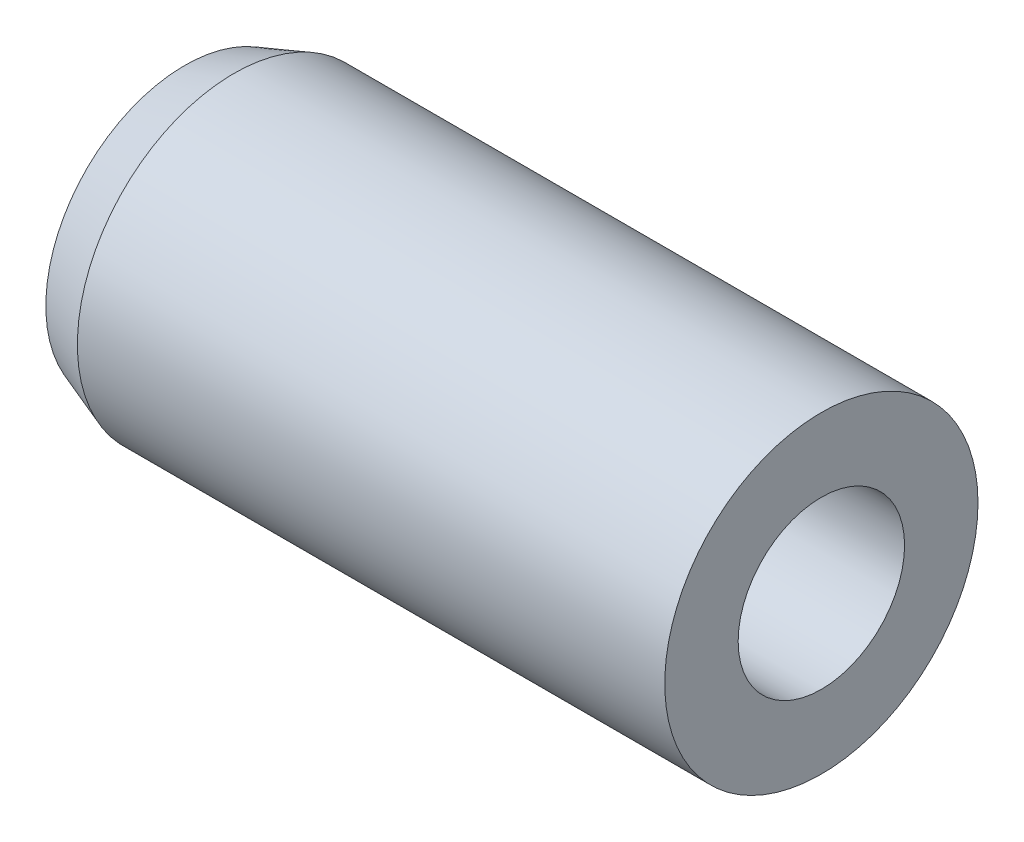
ISO-10303-21;
HEADER;
FILE_DESCRIPTION(('STEP AP214'),'2;1');
FILE_NAME('part.step','',(''),(''),'','','');
FILE_SCHEMA(('AUTOMOTIVE_DESIGN { 1 0 10303 214 1 1 1 1 }'));
ENDSEC;
DATA;
#1=APPLICATION_CONTEXT('core data for automotive mechanical design processes');
#2=APPLICATION_PROTOCOL_DEFINITION('international standard','automotive_design',2000,#1);
#3=PRODUCT_CONTEXT('',#1,'mechanical');
#4=PRODUCT('Part','Part','',(#3));
#5=PRODUCT_RELATED_PRODUCT_CATEGORY('part','',(#4));
#6=PRODUCT_DEFINITION_FORMATION('','',#4);
#7=PRODUCT_DEFINITION_CONTEXT('part definition',#1,'design');
#8=PRODUCT_DEFINITION('design','',#6,#7);
#9=PRODUCT_DEFINITION_SHAPE('','',#8);
#10=(LENGTH_UNIT() NAMED_UNIT(*) SI_UNIT(.MILLI.,.METRE.));
#11=(NAMED_UNIT(*) PLANE_ANGLE_UNIT() SI_UNIT($,.RADIAN.));
#12=(NAMED_UNIT(*) SI_UNIT($,.STERADIAN.) SOLID_ANGLE_UNIT());
#13=UNCERTAINTY_MEASURE_WITH_UNIT(LENGTH_MEASURE(1.E-05),#10,'distance_accuracy_value','');
#14=(GEOMETRIC_REPRESENTATION_CONTEXT(3) GLOBAL_UNCERTAINTY_ASSIGNED_CONTEXT((#13)) GLOBAL_UNIT_ASSIGNED_CONTEXT((#10,
#11,#12)) REPRESENTATION_CONTEXT('',''));
#15=CARTESIAN_POINT('',(0.,0.,0.));
#16=DIRECTION('',(0.,0.,1.));
#17=DIRECTION('',(1.,0.,0.));
#18=AXIS2_PLACEMENT_3D('',#15,#16,#17);
#19=CARTESIAN_POINT('',(0.,0.,0.));
#20=DIRECTION('',(1.,0.,0.));
#21=DIRECTION('',(0.,0.,-1.));
#22=AXIS2_PLACEMENT_3D('',#19,#20,#21);
#23=PLANE('',#22);
#24=CARTESIAN_POINT('',(0.,0.,0.));
#25=DIRECTION('',(1.,0.,0.));
#26=DIRECTION('',(0.,0.,-1.));
#27=AXIS2_PLACEMENT_3D('',#24,#25,#26);
#28=CIRCLE('',#27,4.24999999999999);
#29=CARTESIAN_POINT('',(0.,0.,-4.24999999999999));
#30=VERTEX_POINT('',#29);
#31=EDGE_CURVE('E165',#30,#30,#28,.T.);
#32=ORIENTED_EDGE('',*,*,#31,.F.);
#33=EDGE_LOOP('',(#32));
#34=FACE_BOUND('',#33,.T.);
#35=CARTESIAN_POINT('',(0.,0.,0.));
#36=DIRECTION('',(1.,0.,0.));
#37=DIRECTION('',(0.,0.,-1.));
#38=AXIS2_PLACEMENT_3D('',#35,#36,#37);
#39=CIRCLE('',#38,8.);
#40=CARTESIAN_POINT('',(0.,0.,-8.));
#41=VERTEX_POINT('',#40);
#42=EDGE_CURVE('E11',#41,#41,#39,.T.);
#43=ORIENTED_EDGE('',*,*,#42,.T.);
#44=EDGE_LOOP('',(#43));
#45=FACE_BOUND('',#44,.T.);
#46=ADVANCED_FACE('F50',(#34,#45),#23,.T.);
#47=CARTESIAN_POINT('',(0.,0.,0.));
#48=DIRECTION('',(1.,0.,0.));
#49=DIRECTION('',(0.,0.,-1.));
#50=AXIS2_PLACEMENT_3D('',#47,#48,#49);
#51=CYLINDRICAL_SURFACE('',#50,8.);
#52=CARTESIAN_POINT('',(-30.,0.,0.));
#53=DIRECTION('',(1.,0.,0.));
#54=DIRECTION('',(0.,0.,-1.));
#55=AXIS2_PLACEMENT_3D('',#52,#53,#54);
#56=CIRCLE('',#55,8.);
#57=CARTESIAN_POINT('',(-30.,0.,-8.));
#58=VERTEX_POINT('',#57);
#59=EDGE_CURVE('E58',#58,#58,#56,.T.);
#60=ORIENTED_EDGE('',*,*,#59,.T.);
#61=EDGE_LOOP('',(#60));
#62=FACE_BOUND('',#61,.T.);
#63=ORIENTED_EDGE('',*,*,#42,.F.);
#64=EDGE_LOOP('',(#63));
#65=FACE_BOUND('',#64,.T.);
#66=ADVANCED_FACE('F192',(#62,#65),#51,.T.);
#67=CARTESIAN_POINT('',(-30.,0.,0.));
#68=DIRECTION('',(1.,0.,0.));
#69=DIRECTION('',(0.,0.,-1.));
#70=AXIS2_PLACEMENT_3D('',#67,#68,#69);
#71=CONICAL_SURFACE('',#70,8.,0.345719903586629);
#72=CARTESIAN_POINT('',(-32.5183201820731,0.,0.));
#73=DIRECTION('',(1.,0.,0.));
#74=DIRECTION('',(0.,0.,-1.));
#75=AXIS2_PLACEMENT_3D('',#72,#73,#74);
#76=CIRCLE('',#75,7.09293725805066);
#77=CARTESIAN_POINT('',(-32.5183201820731,0.,-7.09293725805066));
#78=VERTEX_POINT('',#77);
#79=EDGE_CURVE('E184',#78,#78,#76,.T.);
#80=ORIENTED_EDGE('',*,*,#79,.T.);
#81=EDGE_LOOP('',(#80));
#82=FACE_BOUND('',#81,.T.);
#83=ORIENTED_EDGE('',*,*,#59,.F.);
#84=EDGE_LOOP('',(#83));
#85=FACE_BOUND('',#84,.T.);
#86=ADVANCED_FACE('F195',(#82,#85),#71,.T.);
#87=CARTESIAN_POINT('',(-32.5183201820731,7.09293725805066,0.));
#88=DIRECTION('',(-1.,0.,0.));
#89=DIRECTION('',(0.,0.,1.));
#90=AXIS2_PLACEMENT_3D('',#87,#88,#89);
#91=PLANE('',#90);
#92=DIRECTION('',(0.,-0.499999999999995,0.866025403784442));
#93=VECTOR('',#92,1.);
#94=CARTESIAN_POINT('',(-32.5183201820731,-1.57838037587242,-2.73383500468063));
#95=LINE('',#94,#93);
#96=CARTESIAN_POINT('',(-32.5183201820731,-1.57838037587242,-2.73383500468063));
#97=VERTEX_POINT('',#96);
#98=CARTESIAN_POINT('',(-32.5183201820731,-3.15676075174478,0.));
#99=VERTEX_POINT('',#98);
#100=EDGE_CURVE('E65',#97,#99,#95,.T.);
#101=ORIENTED_EDGE('',*,*,#100,.F.);
#102=DIRECTION('',(0.,-1.,0.));
#103=VECTOR('',#102,1.);
#104=CARTESIAN_POINT('',(-32.5183201820731,1.57838037587237,-2.73383500468066));
#105=LINE('',#104,#103);
#106=CARTESIAN_POINT('',(-32.5183201820731,1.57838037587237,-2.73383500468066));
#107=VERTEX_POINT('',#106);
#108=EDGE_CURVE('E127',#107,#97,#105,.T.);
#109=ORIENTED_EDGE('',*,*,#108,.F.);
#110=DIRECTION('',(0.,-0.500000000000007,-0.866025403784435));
#111=VECTOR('',#110,1.);
#112=CARTESIAN_POINT('',(-32.5183201820731,3.15676075174478,0.));
#113=LINE('',#112,#111);
#114=CARTESIAN_POINT('',(-32.5183201820731,3.15676075174478,0.));
#115=VERTEX_POINT('',#114);
#116=EDGE_CURVE('E132',#115,#107,#113,.T.);
#117=ORIENTED_EDGE('',*,*,#116,.F.);
#118=DIRECTION('',(0.,0.499999999999995,-0.866025403784442));
#119=VECTOR('',#118,1.);
#120=CARTESIAN_POINT('',(-32.5183201820731,1.5783803758724,2.73383500468064));
#121=LINE('',#120,#119);
#122=CARTESIAN_POINT('',(-32.5183201820731,1.5783803758724,2.73383500468064));
#123=VERTEX_POINT('',#122);
#124=EDGE_CURVE('E155',#123,#115,#121,.T.);
#125=ORIENTED_EDGE('',*,*,#124,.F.);
#126=DIRECTION('',(0.,1.,0.));
#127=VECTOR('',#126,1.);
#128=CARTESIAN_POINT('',(-32.5183201820731,-1.57838037587239,2.73383500468065));
#129=LINE('',#128,#127);
#130=CARTESIAN_POINT('',(-32.5183201820731,-1.57838037587239,2.73383500468065));
#131=VERTEX_POINT('',#130);
#132=EDGE_CURVE('E151',#131,#123,#129,.T.);
#133=ORIENTED_EDGE('',*,*,#132,.F.);
#134=DIRECTION('',(0.,0.500000000000001,0.866025403784438));
#135=VECTOR('',#134,1.);
#136=CARTESIAN_POINT('',(-32.5183201820731,-3.15676075174478,0.));
#137=LINE('',#136,#135);
#138=EDGE_CURVE('E148',#99,#131,#137,.T.);
#139=ORIENTED_EDGE('',*,*,#138,.F.);
#140=EDGE_LOOP('',(#101,#109,#117,#125,#133,#139));
#141=FACE_BOUND('',#140,.T.);
#142=ORIENTED_EDGE('',*,*,#79,.F.);
#143=EDGE_LOOP('',(#142));
#144=FACE_BOUND('',#143,.T.);
#145=ADVANCED_FACE('F197',(#141,#144),#91,.T.);
#146=CARTESIAN_POINT('',(-15.,0.,0.));
#147=DIRECTION('',(1.,0.,0.));
#148=DIRECTION('',(0.,0.,-1.));
#149=AXIS2_PLACEMENT_3D('',#146,#147,#148);
#150=CONICAL_SURFACE('',#149,4.24999999999999,1.02974425867665);
#151=CARTESIAN_POINT('',(-17.5536576308671,0.,0.));
#152=VERTEX_POINT('',#151);
#153=VERTEX_LOOP('',#152);
#154=FACE_BOUND('',#153,.T.);
#155=CARTESIAN_POINT('',(-15.,0.,0.));
#156=DIRECTION('',(1.,0.,0.));
#157=DIRECTION('',(0.,0.,-1.));
#158=AXIS2_PLACEMENT_3D('',#155,#156,#157);
#159=CIRCLE('',#158,4.24999999999999);
#160=CARTESIAN_POINT('',(-15.,0.,-4.24999999999999));
#161=VERTEX_POINT('',#160);
#162=EDGE_CURVE('E180',#161,#161,#159,.T.);
#163=ORIENTED_EDGE('',*,*,#162,.T.);
#164=EDGE_LOOP('',(#163));
#165=FACE_BOUND('',#164,.T.);
#166=ADVANCED_FACE('F205',(#154,#165),#150,.F.);
#167=CARTESIAN_POINT('',(0.,0.,0.));
#168=DIRECTION('',(1.,0.,0.));
#169=DIRECTION('',(0.,0.,-1.));
#170=AXIS2_PLACEMENT_3D('',#167,#168,#169);
#171=CYLINDRICAL_SURFACE('',#170,4.24999999999999);
#172=ORIENTED_EDGE('',*,*,#162,.F.);
#173=EDGE_LOOP('',(#172));
#174=FACE_BOUND('',#173,.T.);
#175=ORIENTED_EDGE('',*,*,#31,.T.);
#176=EDGE_LOOP('',(#175));
#177=FACE_BOUND('',#176,.T.);
#178=ADVANCED_FACE('F218',(#174,#177),#171,.F.);
#179=CARTESIAN_POINT('',(-27.5183201820731,-1.57838037587242,-2.73383500468063));
#180=DIRECTION('',(0.,-0.866025403784442,-0.499999999999995));
#181=DIRECTION('',(0.,0.499999999999995,-0.866025403784442));
#182=AXIS2_PLACEMENT_3D('',#179,#180,#181);
#183=PLANE('',#182);
#184=ORIENTED_EDGE('',*,*,#100,.T.);
#185=DIRECTION('',(-1.,0.,0.));
#186=VECTOR('',#185,1.);
#187=CARTESIAN_POINT('',(-27.5183201820731,-3.15676075174478,0.));
#188=LINE('',#187,#186);
#189=CARTESIAN_POINT('',(-27.5183201820731,-3.15676075174478,0.));
#190=VERTEX_POINT('',#189);
#191=EDGE_CURVE('E101',#190,#99,#188,.T.);
#192=ORIENTED_EDGE('',*,*,#191,.F.);
#193=DIRECTION('',(0.,-0.499999999999995,0.866025403784442));
#194=VECTOR('',#193,1.);
#195=CARTESIAN_POINT('',(-27.5183201820731,-1.57838037587242,-2.73383500468063));
#196=LINE('',#195,#194);
#197=CARTESIAN_POINT('',(-27.5183201820731,-1.57838037587242,-2.73383500468063));
#198=VERTEX_POINT('',#197);
#199=EDGE_CURVE('E105',#198,#190,#196,.T.);
#200=ORIENTED_EDGE('',*,*,#199,.F.);
#201=DIRECTION('',(-1.,0.,0.));
#202=VECTOR('',#201,1.);
#203=CARTESIAN_POINT('',(-27.5183201820731,-1.57838037587242,-2.73383500468063));
#204=LINE('',#203,#202);
#205=EDGE_CURVE('E162',#198,#97,#204,.T.);
#206=ORIENTED_EDGE('',*,*,#205,.T.);
#207=EDGE_LOOP('',(#184,#192,#200,#206));
#208=FACE_BOUND('',#207,.T.);
#209=ADVANCED_FACE('F103',(#208),#183,.F.);
#210=CARTESIAN_POINT('',(-27.5183201820731,1.57838037587237,-2.73383500468066));
#211=DIRECTION('',(0.,0.,-1.));
#212=DIRECTION('',(0.,1.,0.));
#213=AXIS2_PLACEMENT_3D('',#210,#211,#212);
#214=PLANE('',#213);
#215=ORIENTED_EDGE('',*,*,#108,.T.);
#216=ORIENTED_EDGE('',*,*,#205,.F.);
#217=DIRECTION('',(0.,-1.,0.));
#218=VECTOR('',#217,1.);
#219=CARTESIAN_POINT('',(-27.5183201820731,1.57838037587237,-2.73383500468066));
#220=LINE('',#219,#218);
#221=CARTESIAN_POINT('',(-27.5183201820731,1.57838037587237,-2.73383500468066));
#222=VERTEX_POINT('',#221);
#223=EDGE_CURVE('E112',#222,#198,#220,.T.);
#224=ORIENTED_EDGE('',*,*,#223,.F.);
#225=DIRECTION('',(-1.,0.,0.));
#226=VECTOR('',#225,1.);
#227=CARTESIAN_POINT('',(-27.5183201820731,1.57838037587237,-2.73383500468066));
#228=LINE('',#227,#226);
#229=EDGE_CURVE('E166',#222,#107,#228,.T.);
#230=ORIENTED_EDGE('',*,*,#229,.T.);
#231=EDGE_LOOP('',(#215,#216,#224,#230));
#232=FACE_BOUND('',#231,.T.);
#233=ADVANCED_FACE('F224',(#232),#214,.F.);
#234=CARTESIAN_POINT('',(-27.5183201820731,3.15676075174478,0.));
#235=DIRECTION('',(0.,0.866025403784434,-0.500000000000007));
#236=DIRECTION('',(0.,0.500000000000007,0.866025403784435));
#237=AXIS2_PLACEMENT_3D('',#234,#235,#236);
#238=PLANE('',#237);
#239=ORIENTED_EDGE('',*,*,#116,.T.);
#240=ORIENTED_EDGE('',*,*,#229,.F.);
#241=DIRECTION('',(0.,-0.500000000000007,-0.866025403784435));
#242=VECTOR('',#241,1.);
#243=CARTESIAN_POINT('',(-27.5183201820731,3.15676075174478,0.));
#244=LINE('',#243,#242);
#245=CARTESIAN_POINT('',(-27.5183201820731,3.15676075174478,0.));
#246=VERTEX_POINT('',#245);
#247=EDGE_CURVE('E141',#246,#222,#244,.T.);
#248=ORIENTED_EDGE('',*,*,#247,.F.);
#249=DIRECTION('',(-1.,0.,0.));
#250=VECTOR('',#249,1.);
#251=CARTESIAN_POINT('',(-27.5183201820731,3.15676075174478,0.));
#252=LINE('',#251,#250);
#253=EDGE_CURVE('E169',#246,#115,#252,.T.);
#254=ORIENTED_EDGE('',*,*,#253,.T.);
#255=EDGE_LOOP('',(#239,#240,#248,#254));
#256=FACE_BOUND('',#255,.T.);
#257=ADVANCED_FACE('F239',(#256),#238,.F.);
#258=CARTESIAN_POINT('',(-27.5183201820731,1.5783803758724,2.73383500468064));
#259=DIRECTION('',(0.,0.866025403784442,0.499999999999995));
#260=DIRECTION('',(0.,-0.499999999999995,0.866025403784442));
#261=AXIS2_PLACEMENT_3D('',#258,#259,#260);
#262=PLANE('',#261);
#263=ORIENTED_EDGE('',*,*,#124,.T.);
#264=ORIENTED_EDGE('',*,*,#253,.F.);
#265=DIRECTION('',(0.,0.499999999999995,-0.866025403784442));
#266=VECTOR('',#265,1.);
#267=CARTESIAN_POINT('',(-27.5183201820731,1.5783803758724,2.73383500468064));
#268=LINE('',#267,#266);
#269=CARTESIAN_POINT('',(-27.5183201820731,1.5783803758724,2.73383500468064));
#270=VERTEX_POINT('',#269);
#271=EDGE_CURVE('E137',#270,#246,#268,.T.);
#272=ORIENTED_EDGE('',*,*,#271,.F.);
#273=DIRECTION('',(-1.,0.,0.));
#274=VECTOR('',#273,1.);
#275=CARTESIAN_POINT('',(-27.5183201820731,1.5783803758724,2.73383500468064));
#276=LINE('',#275,#274);
#277=EDGE_CURVE('E172',#270,#123,#276,.T.);
#278=ORIENTED_EDGE('',*,*,#277,.T.);
#279=EDGE_LOOP('',(#263,#264,#272,#278));
#280=FACE_BOUND('',#279,.T.);
#281=ADVANCED_FACE('F235',(#280),#262,.F.);
#282=CARTESIAN_POINT('',(-27.5183201820731,-1.57838037587239,2.73383500468065));
#283=DIRECTION('',(0.,0.,1.));
#284=DIRECTION('',(0.,-1.,0.));
#285=AXIS2_PLACEMENT_3D('',#282,#283,#284);
#286=PLANE('',#285);
#287=ORIENTED_EDGE('',*,*,#132,.T.);
#288=ORIENTED_EDGE('',*,*,#277,.F.);
#289=DIRECTION('',(0.,1.,0.));
#290=VECTOR('',#289,1.);
#291=CARTESIAN_POINT('',(-27.5183201820731,-1.57838037587239,2.73383500468065));
#292=LINE('',#291,#290);
#293=CARTESIAN_POINT('',(-27.5183201820731,-1.57838037587239,2.73383500468065));
#294=VERTEX_POINT('',#293);
#295=EDGE_CURVE('E121',#294,#270,#292,.T.);
#296=ORIENTED_EDGE('',*,*,#295,.F.);
#297=DIRECTION('',(-1.,0.,0.));
#298=VECTOR('',#297,1.);
#299=CARTESIAN_POINT('',(-27.5183201820731,-1.57838037587239,2.73383500468065));
#300=LINE('',#299,#298);
#301=EDGE_CURVE('E111',#294,#131,#300,.T.);
#302=ORIENTED_EDGE('',*,*,#301,.T.);
#303=EDGE_LOOP('',(#287,#288,#296,#302));
#304=FACE_BOUND('',#303,.T.);
#305=ADVANCED_FACE('F232',(#304),#286,.F.);
#306=CARTESIAN_POINT('',(-27.5183201820731,-3.15676075174478,0.));
#307=DIRECTION('',(0.,-0.866025403784438,0.500000000000001));
#308=DIRECTION('',(0.,-0.500000000000001,-0.866025403784438));
#309=AXIS2_PLACEMENT_3D('',#306,#307,#308);
#310=PLANE('',#309);
#311=ORIENTED_EDGE('',*,*,#138,.T.);
#312=ORIENTED_EDGE('',*,*,#301,.F.);
#313=DIRECTION('',(0.,0.500000000000001,0.866025403784438));
#314=VECTOR('',#313,1.);
#315=CARTESIAN_POINT('',(-27.5183201820731,-3.15676075174478,0.));
#316=LINE('',#315,#314);
#317=EDGE_CURVE('E115',#190,#294,#316,.T.);
#318=ORIENTED_EDGE('',*,*,#317,.F.);
#319=ORIENTED_EDGE('',*,*,#191,.T.);
#320=EDGE_LOOP('',(#311,#312,#318,#319));
#321=FACE_BOUND('',#320,.T.);
#322=ADVANCED_FACE('F116',(#321),#310,.F.);
#323=CARTESIAN_POINT('',(-27.5183201820731,0.,0.));
#324=DIRECTION('',(-1.,0.,0.));
#325=DIRECTION('',(0.,0.,1.));
#326=AXIS2_PLACEMENT_3D('',#323,#324,#325);
#327=PLANE('',#326);
#328=ORIENTED_EDGE('',*,*,#199,.T.);
#329=ORIENTED_EDGE('',*,*,#317,.T.);
#330=ORIENTED_EDGE('',*,*,#295,.T.);
#331=ORIENTED_EDGE('',*,*,#271,.T.);
#332=ORIENTED_EDGE('',*,*,#247,.T.);
#333=ORIENTED_EDGE('',*,*,#223,.T.);
#334=EDGE_LOOP('',(#328,#329,#330,#331,#332,#333));
#335=FACE_BOUND('',#334,.T.);
#336=ADVANCED_FACE('F123',(#335),#327,.T.);
#337=CLOSED_SHELL('',(#46,#66,#86,#145,#166,#178,#209,#233,#257,#281,#305,#322,#336));
#338=MANIFOLD_SOLID_BREP('B2',#337);
#339=ADVANCED_BREP_SHAPE_REPRESENTATION('',(#18,#338),#14);
#340=SHAPE_DEFINITION_REPRESENTATION(#9,#339);
ENDSEC;
END-ISO-10303-21;
